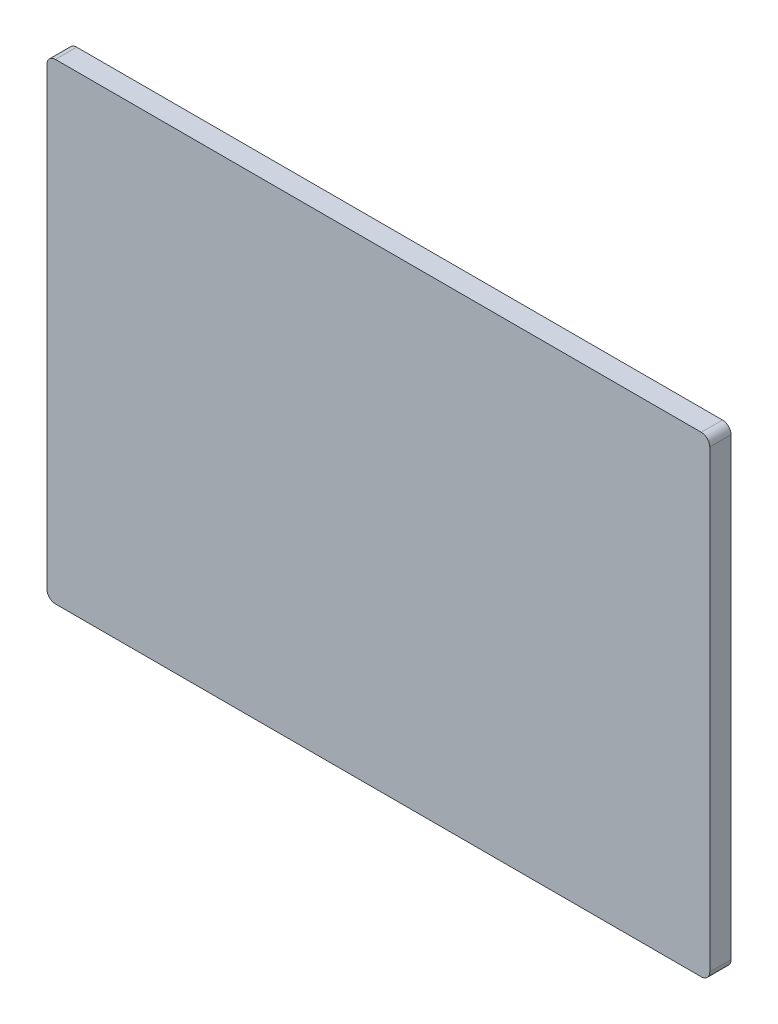
ISO-10303-21;
HEADER;
FILE_DESCRIPTION(('STEP AP214'),'2;1');
FILE_NAME('part.step','',(''),(''),'','','');
FILE_SCHEMA(('AUTOMOTIVE_DESIGN { 1 0 10303 214 1 1 1 1 }'));
ENDSEC;
DATA;
#1=APPLICATION_CONTEXT('core data for automotive mechanical design processes');
#2=APPLICATION_PROTOCOL_DEFINITION('international standard','automotive_design',2000,#1);
#3=PRODUCT_CONTEXT('',#1,'mechanical');
#4=PRODUCT('Part','Part','',(#3));
#5=PRODUCT_RELATED_PRODUCT_CATEGORY('part','',(#4));
#6=PRODUCT_DEFINITION_FORMATION('','',#4);
#7=PRODUCT_DEFINITION_CONTEXT('part definition',#1,'design');
#8=PRODUCT_DEFINITION('design','',#6,#7);
#9=PRODUCT_DEFINITION_SHAPE('','',#8);
#10=(LENGTH_UNIT() NAMED_UNIT(*) SI_UNIT(.MILLI.,.METRE.));
#11=(NAMED_UNIT(*) PLANE_ANGLE_UNIT() SI_UNIT($,.RADIAN.));
#12=(NAMED_UNIT(*) SI_UNIT($,.STERADIAN.) SOLID_ANGLE_UNIT());
#13=UNCERTAINTY_MEASURE_WITH_UNIT(LENGTH_MEASURE(1.E-05),#10,'distance_accuracy_value','');
#14=(GEOMETRIC_REPRESENTATION_CONTEXT(3) GLOBAL_UNCERTAINTY_ASSIGNED_CONTEXT((#13)) GLOBAL_UNIT_ASSIGNED_CONTEXT((#10,
#11,#12)) REPRESENTATION_CONTEXT('',''));
#15=CARTESIAN_POINT('',(0.,0.,0.));
#16=DIRECTION('',(0.,0.,1.));
#17=DIRECTION('',(1.,0.,0.));
#18=AXIS2_PLACEMENT_3D('',#15,#16,#17);
#19=CARTESIAN_POINT('',(-78.,-55.5,5.));
#20=DIRECTION('',(1.,0.,0.));
#21=DIRECTION('',(0.,0.,-1.));
#22=AXIS2_PLACEMENT_3D('',#19,#20,#21);
#23=PLANE('',#22);
#24=DIRECTION('',(0.,-1.,0.));
#25=VECTOR('',#24,1.);
#26=CARTESIAN_POINT('',(-78.,-55.5,0.));
#27=LINE('',#26,#25);
#28=CARTESIAN_POINT('',(-78.,53.5,0.));
#29=VERTEX_POINT('',#28);
#30=CARTESIAN_POINT('',(-78.,-53.5,0.));
#31=VERTEX_POINT('',#30);
#32=EDGE_CURVE('E136',#29,#31,#27,.T.);
#33=ORIENTED_EDGE('',*,*,#32,.T.);
#34=DIRECTION('',(0.,0.,-1.));
#35=VECTOR('',#34,1.);
#36=CARTESIAN_POINT('',(-78.,-53.5,5.));
#37=LINE('',#36,#35);
#38=CARTESIAN_POINT('',(-78.,-53.5,5.));
#39=VERTEX_POINT('',#38);
#40=EDGE_CURVE('E114',#31,#39,#37,.F.);
#41=ORIENTED_EDGE('',*,*,#40,.T.);
#42=DIRECTION('',(0.,-1.,0.));
#43=VECTOR('',#42,1.);
#44=CARTESIAN_POINT('',(-78.,-55.5,5.));
#45=LINE('',#44,#43);
#46=CARTESIAN_POINT('',(-78.,53.5,5.));
#47=VERTEX_POINT('',#46);
#48=EDGE_CURVE('E145',#47,#39,#45,.T.);
#49=ORIENTED_EDGE('',*,*,#48,.F.);
#50=DIRECTION('',(0.,0.,-1.));
#51=VECTOR('',#50,1.);
#52=CARTESIAN_POINT('',(-78.,53.5,5.));
#53=LINE('',#52,#51);
#54=EDGE_CURVE('E119',#47,#29,#53,.T.);
#55=ORIENTED_EDGE('',*,*,#54,.T.);
#56=EDGE_LOOP('',(#33,#41,#49,#55));
#57=FACE_BOUND('',#56,.T.);
#58=ADVANCED_FACE('F43',(#57),#23,.F.);
#59=CARTESIAN_POINT('',(78.,-55.5,5.));
#60=DIRECTION('',(0.,1.,0.));
#61=DIRECTION('',(0.,0.,1.));
#62=AXIS2_PLACEMENT_3D('',#59,#60,#61);
#63=PLANE('',#62);
#64=DIRECTION('',(1.,0.,0.));
#65=VECTOR('',#64,1.);
#66=CARTESIAN_POINT('',(78.,-55.5,5.));
#67=LINE('',#66,#65);
#68=CARTESIAN_POINT('',(-76.,-55.5,5.));
#69=VERTEX_POINT('',#68);
#70=CARTESIAN_POINT('',(76.,-55.5,5.));
#71=VERTEX_POINT('',#70);
#72=EDGE_CURVE('E129',#69,#71,#67,.T.);
#73=ORIENTED_EDGE('',*,*,#72,.F.);
#74=DIRECTION('',(0.,0.,-1.));
#75=VECTOR('',#74,1.);
#76=CARTESIAN_POINT('',(-76.,-55.5,5.));
#77=LINE('',#76,#75);
#78=CARTESIAN_POINT('',(-76.,-55.5,0.));
#79=VERTEX_POINT('',#78);
#80=EDGE_CURVE('E113',#69,#79,#77,.T.);
#81=ORIENTED_EDGE('',*,*,#80,.T.);
#82=DIRECTION('',(1.,0.,0.));
#83=VECTOR('',#82,1.);
#84=CARTESIAN_POINT('',(78.,-55.5,0.));
#85=LINE('',#84,#83);
#86=CARTESIAN_POINT('',(76.,-55.5,0.));
#87=VERTEX_POINT('',#86);
#88=EDGE_CURVE('E126',#79,#87,#85,.T.);
#89=ORIENTED_EDGE('',*,*,#88,.T.);
#90=DIRECTION('',(0.,0.,-1.));
#91=VECTOR('',#90,1.);
#92=CARTESIAN_POINT('',(76.,-55.5,5.));
#93=LINE('',#92,#91);
#94=EDGE_CURVE('E131',#87,#71,#93,.F.);
#95=ORIENTED_EDGE('',*,*,#94,.T.);
#96=EDGE_LOOP('',(#73,#81,#89,#95));
#97=FACE_BOUND('',#96,.T.);
#98=ADVANCED_FACE('F125',(#97),#63,.F.);
#99=CARTESIAN_POINT('',(78.,-55.5,5.));
#100=DIRECTION('',(-1.,0.,0.));
#101=DIRECTION('',(0.,0.,1.));
#102=AXIS2_PLACEMENT_3D('',#99,#100,#101);
#103=PLANE('',#102);
#104=DIRECTION('',(0.,1.,0.));
#105=VECTOR('',#104,1.);
#106=CARTESIAN_POINT('',(78.,-55.5,5.));
#107=LINE('',#106,#105);
#108=CARTESIAN_POINT('',(78.,-53.5,5.));
#109=VERTEX_POINT('',#108);
#110=CARTESIAN_POINT('',(78.,53.5,5.));
#111=VERTEX_POINT('',#110);
#112=EDGE_CURVE('E171',#109,#111,#107,.T.);
#113=ORIENTED_EDGE('',*,*,#112,.F.);
#114=DIRECTION('',(0.,0.,-1.));
#115=VECTOR('',#114,1.);
#116=CARTESIAN_POINT('',(78.,-53.5,5.));
#117=LINE('',#116,#115);
#118=CARTESIAN_POINT('',(78.,-53.5,0.));
#119=VERTEX_POINT('',#118);
#120=EDGE_CURVE('E164',#109,#119,#117,.T.);
#121=ORIENTED_EDGE('',*,*,#120,.T.);
#122=DIRECTION('',(0.,1.,0.));
#123=VECTOR('',#122,1.);
#124=CARTESIAN_POINT('',(78.,-55.5,0.));
#125=LINE('',#124,#123);
#126=CARTESIAN_POINT('',(78.,53.5,0.));
#127=VERTEX_POINT('',#126);
#128=EDGE_CURVE('E135',#119,#127,#125,.T.);
#129=ORIENTED_EDGE('',*,*,#128,.T.);
#130=DIRECTION('',(0.,0.,-1.));
#131=VECTOR('',#130,1.);
#132=CARTESIAN_POINT('',(78.,53.5,5.));
#133=LINE('',#132,#131);
#134=EDGE_CURVE('E162',#127,#111,#133,.F.);
#135=ORIENTED_EDGE('',*,*,#134,.T.);
#136=EDGE_LOOP('',(#113,#121,#129,#135));
#137=FACE_BOUND('',#136,.T.);
#138=ADVANCED_FACE('F169',(#137),#103,.F.);
#139=CARTESIAN_POINT('',(78.,55.5,5.));
#140=DIRECTION('',(0.,-1.,0.));
#141=DIRECTION('',(0.,0.,-1.));
#142=AXIS2_PLACEMENT_3D('',#139,#140,#141);
#143=PLANE('',#142);
#144=DIRECTION('',(-1.,0.,0.));
#145=VECTOR('',#144,1.);
#146=CARTESIAN_POINT('',(78.,55.5,5.));
#147=LINE('',#146,#145);
#148=CARTESIAN_POINT('',(76.,55.5,5.));
#149=VERTEX_POINT('',#148);
#150=CARTESIAN_POINT('',(-76.,55.5,5.));
#151=VERTEX_POINT('',#150);
#152=EDGE_CURVE('E146',#149,#151,#147,.T.);
#153=ORIENTED_EDGE('',*,*,#152,.F.);
#154=DIRECTION('',(0.,0.,-1.));
#155=VECTOR('',#154,1.);
#156=CARTESIAN_POINT('',(76.,55.5,5.));
#157=LINE('',#156,#155);
#158=CARTESIAN_POINT('',(76.,55.5,0.));
#159=VERTEX_POINT('',#158);
#160=EDGE_CURVE('E11',#149,#159,#157,.T.);
#161=ORIENTED_EDGE('',*,*,#160,.T.);
#162=DIRECTION('',(-1.,0.,0.));
#163=VECTOR('',#162,1.);
#164=CARTESIAN_POINT('',(78.,55.5,0.));
#165=LINE('',#164,#163);
#166=CARTESIAN_POINT('',(-76.,55.5,0.));
#167=VERTEX_POINT('',#166);
#168=EDGE_CURVE('E139',#159,#167,#165,.T.);
#169=ORIENTED_EDGE('',*,*,#168,.T.);
#170=DIRECTION('',(0.,0.,-1.));
#171=VECTOR('',#170,1.);
#172=CARTESIAN_POINT('',(-76.,55.5,5.));
#173=LINE('',#172,#171);
#174=EDGE_CURVE('E51',#167,#151,#173,.F.);
#175=ORIENTED_EDGE('',*,*,#174,.T.);
#176=EDGE_LOOP('',(#153,#161,#169,#175));
#177=FACE_BOUND('',#176,.T.);
#178=ADVANCED_FACE('F178',(#177),#143,.F.);
#179=CARTESIAN_POINT('',(0.,0.,5.));
#180=DIRECTION('',(0.,0.,1.));
#181=DIRECTION('',(1.,0.,0.));
#182=AXIS2_PLACEMENT_3D('',#179,#180,#181);
#183=PLANE('',#182);
#184=ORIENTED_EDGE('',*,*,#48,.T.);
#185=CARTESIAN_POINT('',(-76.,-53.5,5.));
#186=DIRECTION('',(0.,0.,1.));
#187=DIRECTION('',(1.,0.,0.));
#188=AXIS2_PLACEMENT_3D('',#185,#186,#187);
#189=CIRCLE('',#188,2.);
#190=EDGE_CURVE('E160',#39,#69,#189,.T.);
#191=ORIENTED_EDGE('',*,*,#190,.T.);
#192=ORIENTED_EDGE('',*,*,#72,.T.);
#193=CARTESIAN_POINT('',(76.,-53.5,5.));
#194=DIRECTION('',(0.,0.,1.));
#195=DIRECTION('',(1.,0.,0.));
#196=AXIS2_PLACEMENT_3D('',#193,#194,#195);
#197=CIRCLE('',#196,2.);
#198=EDGE_CURVE('E158',#71,#109,#197,.T.);
#199=ORIENTED_EDGE('',*,*,#198,.T.);
#200=ORIENTED_EDGE('',*,*,#112,.T.);
#201=CARTESIAN_POINT('',(76.,53.5,5.));
#202=DIRECTION('',(0.,0.,1.));
#203=DIRECTION('',(1.,0.,0.));
#204=AXIS2_PLACEMENT_3D('',#201,#202,#203);
#205=CIRCLE('',#204,2.);
#206=EDGE_CURVE('E64',#111,#149,#205,.T.);
#207=ORIENTED_EDGE('',*,*,#206,.T.);
#208=ORIENTED_EDGE('',*,*,#152,.T.);
#209=CARTESIAN_POINT('',(-76.,53.5,5.));
#210=DIRECTION('',(0.,0.,1.));
#211=DIRECTION('',(1.,0.,0.));
#212=AXIS2_PLACEMENT_3D('',#209,#210,#211);
#213=CIRCLE('',#212,2.);
#214=EDGE_CURVE('E155',#151,#47,#213,.T.);
#215=ORIENTED_EDGE('',*,*,#214,.T.);
#216=EDGE_LOOP('',(#184,#191,#192,#199,#200,#207,#208,#215));
#217=FACE_BOUND('',#216,.T.);
#218=ADVANCED_FACE('F185',(#217),#183,.T.);
#219=CARTESIAN_POINT('',(0.,0.,0.));
#220=DIRECTION('',(0.,0.,1.));
#221=DIRECTION('',(1.,0.,0.));
#222=AXIS2_PLACEMENT_3D('',#219,#220,#221);
#223=PLANE('',#222);
#224=ORIENTED_EDGE('',*,*,#88,.F.);
#225=CARTESIAN_POINT('',(-76.,-53.5,0.));
#226=DIRECTION('',(0.,0.,1.));
#227=DIRECTION('',(1.,0.,0.));
#228=AXIS2_PLACEMENT_3D('',#225,#226,#227);
#229=CIRCLE('',#228,2.);
#230=EDGE_CURVE('E109',#79,#31,#229,.F.);
#231=ORIENTED_EDGE('',*,*,#230,.T.);
#232=ORIENTED_EDGE('',*,*,#32,.F.);
#233=CARTESIAN_POINT('',(-76.,53.5,0.));
#234=DIRECTION('',(0.,0.,1.));
#235=DIRECTION('',(1.,0.,0.));
#236=AXIS2_PLACEMENT_3D('',#233,#234,#235);
#237=CIRCLE('',#236,2.);
#238=EDGE_CURVE('E130',#29,#167,#237,.F.);
#239=ORIENTED_EDGE('',*,*,#238,.T.);
#240=ORIENTED_EDGE('',*,*,#168,.F.);
#241=CARTESIAN_POINT('',(76.,53.5,0.));
#242=DIRECTION('',(0.,0.,1.));
#243=DIRECTION('',(1.,0.,0.));
#244=AXIS2_PLACEMENT_3D('',#241,#242,#243);
#245=CIRCLE('',#244,2.);
#246=EDGE_CURVE('E149',#159,#127,#245,.F.);
#247=ORIENTED_EDGE('',*,*,#246,.T.);
#248=ORIENTED_EDGE('',*,*,#128,.F.);
#249=CARTESIAN_POINT('',(76.,-53.5,0.));
#250=DIRECTION('',(0.,0.,1.));
#251=DIRECTION('',(1.,0.,0.));
#252=AXIS2_PLACEMENT_3D('',#249,#250,#251);
#253=CIRCLE('',#252,2.);
#254=EDGE_CURVE('E120',#119,#87,#253,.F.);
#255=ORIENTED_EDGE('',*,*,#254,.T.);
#256=EDGE_LOOP('',(#224,#231,#232,#239,#240,#247,#248,#255));
#257=FACE_BOUND('',#256,.T.);
#258=ADVANCED_FACE('F133',(#257),#223,.F.);
#259=CARTESIAN_POINT('',(-76.,-53.5,5.));
#260=DIRECTION('',(0.,0.,-1.));
#261=DIRECTION('',(-1.,0.,0.));
#262=AXIS2_PLACEMENT_3D('',#259,#260,#261);
#263=CYLINDRICAL_SURFACE('',#262,2.);
#264=ORIENTED_EDGE('',*,*,#190,.F.);
#265=ORIENTED_EDGE('',*,*,#40,.F.);
#266=ORIENTED_EDGE('',*,*,#230,.F.);
#267=ORIENTED_EDGE('',*,*,#80,.F.);
#268=EDGE_LOOP('',(#264,#265,#266,#267));
#269=FACE_BOUND('',#268,.T.);
#270=ADVANCED_FACE('F112',(#269),#263,.T.);
#271=CARTESIAN_POINT('',(76.,-53.5,5.));
#272=DIRECTION('',(0.,0.,-1.));
#273=DIRECTION('',(-1.,0.,0.));
#274=AXIS2_PLACEMENT_3D('',#271,#272,#273);
#275=CYLINDRICAL_SURFACE('',#274,2.);
#276=ORIENTED_EDGE('',*,*,#198,.F.);
#277=ORIENTED_EDGE('',*,*,#94,.F.);
#278=ORIENTED_EDGE('',*,*,#254,.F.);
#279=ORIENTED_EDGE('',*,*,#120,.F.);
#280=EDGE_LOOP('',(#276,#277,#278,#279));
#281=FACE_BOUND('',#280,.T.);
#282=ADVANCED_FACE('F193',(#281),#275,.T.);
#283=CARTESIAN_POINT('',(76.,53.5,5.));
#284=DIRECTION('',(0.,0.,-1.));
#285=DIRECTION('',(-1.,0.,0.));
#286=AXIS2_PLACEMENT_3D('',#283,#284,#285);
#287=CYLINDRICAL_SURFACE('',#286,2.);
#288=ORIENTED_EDGE('',*,*,#206,.F.);
#289=ORIENTED_EDGE('',*,*,#134,.F.);
#290=ORIENTED_EDGE('',*,*,#246,.F.);
#291=ORIENTED_EDGE('',*,*,#160,.F.);
#292=EDGE_LOOP('',(#288,#289,#290,#291));
#293=FACE_BOUND('',#292,.T.);
#294=ADVANCED_FACE('F177',(#293),#287,.T.);
#295=CARTESIAN_POINT('',(-76.,53.5,5.));
#296=DIRECTION('',(0.,0.,-1.));
#297=DIRECTION('',(-1.,0.,0.));
#298=AXIS2_PLACEMENT_3D('',#295,#296,#297);
#299=CYLINDRICAL_SURFACE('',#298,2.);
#300=ORIENTED_EDGE('',*,*,#214,.F.);
#301=ORIENTED_EDGE('',*,*,#174,.F.);
#302=ORIENTED_EDGE('',*,*,#238,.F.);
#303=ORIENTED_EDGE('',*,*,#54,.F.);
#304=EDGE_LOOP('',(#300,#301,#302,#303));
#305=FACE_BOUND('',#304,.T.);
#306=ADVANCED_FACE('F45',(#305),#299,.T.);
#307=CLOSED_SHELL('',(#58,#98,#138,#178,#218,#258,#270,#282,#294,#306));
#308=MANIFOLD_SOLID_BREP('B2',#307);
#309=ADVANCED_BREP_SHAPE_REPRESENTATION('',(#18,#308),#14);
#310=SHAPE_DEFINITION_REPRESENTATION(#9,#309);
ENDSEC;
END-ISO-10303-21;
